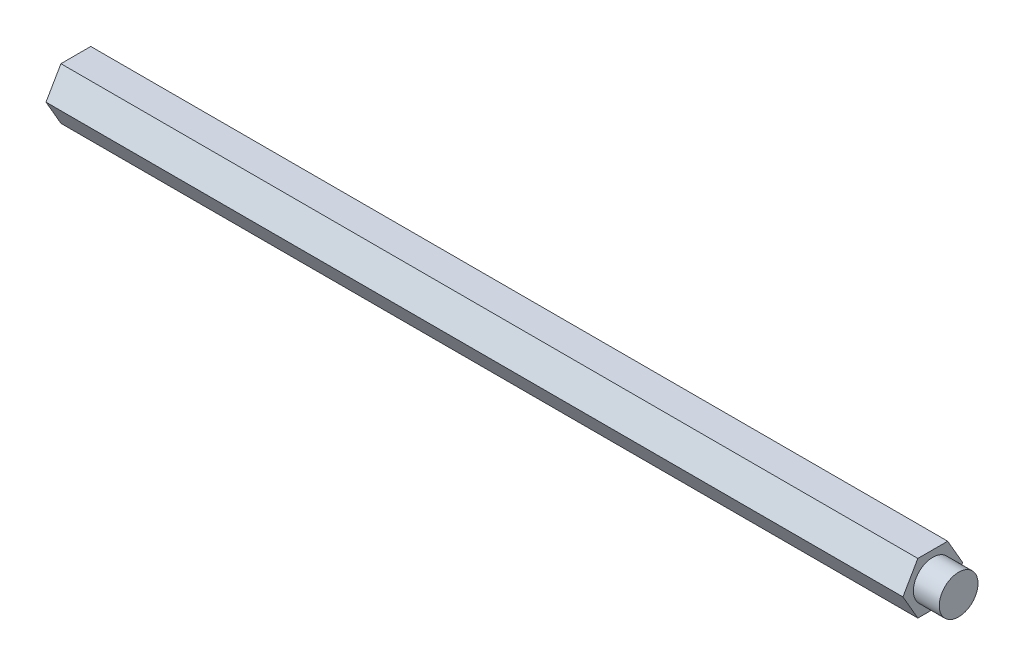
ISO-10303-21;
HEADER;
FILE_DESCRIPTION(('STEP AP214'),'2;1');
FILE_NAME('part.step','',(''),(''),'','','');
FILE_SCHEMA(('AUTOMOTIVE_DESIGN { 1 0 10303 214 1 1 1 1 }'));
ENDSEC;
DATA;
#1=APPLICATION_CONTEXT('core data for automotive mechanical design processes');
#2=APPLICATION_PROTOCOL_DEFINITION('international standard','automotive_design',2000,#1);
#3=PRODUCT_CONTEXT('',#1,'mechanical');
#4=PRODUCT('Part','Part','',(#3));
#5=PRODUCT_RELATED_PRODUCT_CATEGORY('part','',(#4));
#6=PRODUCT_DEFINITION_FORMATION('','',#4);
#7=PRODUCT_DEFINITION_CONTEXT('part definition',#1,'design');
#8=PRODUCT_DEFINITION('design','',#6,#7);
#9=PRODUCT_DEFINITION_SHAPE('','',#8);
#10=(LENGTH_UNIT() NAMED_UNIT(*) SI_UNIT(.MILLI.,.METRE.));
#11=(NAMED_UNIT(*) PLANE_ANGLE_UNIT() SI_UNIT($,.RADIAN.));
#12=(NAMED_UNIT(*) SI_UNIT($,.STERADIAN.) SOLID_ANGLE_UNIT());
#13=UNCERTAINTY_MEASURE_WITH_UNIT(LENGTH_MEASURE(1.E-05),#10,'distance_accuracy_value','');
#14=(GEOMETRIC_REPRESENTATION_CONTEXT(3) GLOBAL_UNCERTAINTY_ASSIGNED_CONTEXT((#13)) GLOBAL_UNIT_ASSIGNED_CONTEXT((#10,
#11,#12)) REPRESENTATION_CONTEXT('',''));
#15=CARTESIAN_POINT('',(0.,0.,0.));
#16=DIRECTION('',(0.,0.,1.));
#17=DIRECTION('',(1.,0.,0.));
#18=AXIS2_PLACEMENT_3D('',#15,#16,#17);
#19=CARTESIAN_POINT('',(210.53,-6.34999999999996,-3.6661742093542));
#20=DIRECTION('',(0.,0.499999999999995,0.866025403784441));
#21=DIRECTION('',(0.,-0.866025403784441,0.499999999999995));
#22=AXIS2_PLACEMENT_3D('',#19,#20,#21);
#23=PLANE('',#22);
#24=DIRECTION('',(0.,0.866025403784441,-0.499999999999995));
#25=VECTOR('',#24,1.);
#26=CARTESIAN_POINT('',(0.,-6.34999999999996,-3.6661742093542));
#27=LINE('',#26,#25);
#28=CARTESIAN_POINT('',(0.,-6.34999999999996,-3.6661742093542));
#29=VERTEX_POINT('',#28);
#30=CARTESIAN_POINT('',(0.,0.,-7.33234841870825));
#31=VERTEX_POINT('',#30);
#32=EDGE_CURVE('E127',#29,#31,#27,.T.);
#33=ORIENTED_EDGE('',*,*,#32,.T.);
#34=DIRECTION('',(-1.,0.,0.));
#35=VECTOR('',#34,1.);
#36=CARTESIAN_POINT('',(210.53,0.,-7.33234841870825));
#37=LINE('',#36,#35);
#38=CARTESIAN_POINT('',(210.53,0.,-7.33234841870825));
#39=VERTEX_POINT('',#38);
#40=EDGE_CURVE('E44',#39,#31,#37,.T.);
#41=ORIENTED_EDGE('',*,*,#40,.F.);
#42=DIRECTION('',(0.,0.866025403784441,-0.499999999999995));
#43=VECTOR('',#42,1.);
#44=CARTESIAN_POINT('',(210.53,-6.34999999999996,-3.6661742093542));
#45=LINE('',#44,#43);
#46=CARTESIAN_POINT('',(210.53,-6.34999999999996,-3.6661742093542));
#47=VERTEX_POINT('',#46);
#48=EDGE_CURVE('E138',#47,#39,#45,.T.);
#49=ORIENTED_EDGE('',*,*,#48,.F.);
#50=DIRECTION('',(-1.,0.,0.));
#51=VECTOR('',#50,1.);
#52=CARTESIAN_POINT('',(210.53,-6.34999999999996,-3.6661742093542));
#53=LINE('',#52,#51);
#54=EDGE_CURVE('E123',#47,#29,#53,.T.);
#55=ORIENTED_EDGE('',*,*,#54,.T.);
#56=EDGE_LOOP('',(#33,#41,#49,#55));
#57=FACE_BOUND('',#56,.T.);
#58=ADVANCED_FACE('F41',(#57),#23,.F.);
#59=CARTESIAN_POINT('',(210.53,0.,-7.33234841870825));
#60=DIRECTION('',(0.,-0.500000000000001,0.866025403784438));
#61=DIRECTION('',(0.,-0.866025403784438,-0.500000000000001));
#62=AXIS2_PLACEMENT_3D('',#59,#60,#61);
#63=PLANE('',#62);
#64=DIRECTION('',(0.,0.866025403784438,0.500000000000001));
#65=VECTOR('',#64,1.);
#66=CARTESIAN_POINT('',(0.,0.,-7.33234841870825));
#67=LINE('',#66,#65);
#68=CARTESIAN_POINT('',(0.,6.35000000000001,-3.66617420935411));
#69=VERTEX_POINT('',#68);
#70=EDGE_CURVE('E130',#31,#69,#67,.T.);
#71=ORIENTED_EDGE('',*,*,#70,.T.);
#72=DIRECTION('',(-1.,0.,0.));
#73=VECTOR('',#72,1.);
#74=CARTESIAN_POINT('',(210.53,6.35000000000001,-3.66617420935411));
#75=LINE('',#74,#73);
#76=CARTESIAN_POINT('',(210.53,6.35000000000001,-3.66617420935411));
#77=VERTEX_POINT('',#76);
#78=EDGE_CURVE('E141',#77,#69,#75,.T.);
#79=ORIENTED_EDGE('',*,*,#78,.F.);
#80=DIRECTION('',(0.,0.866025403784438,0.500000000000001));
#81=VECTOR('',#80,1.);
#82=CARTESIAN_POINT('',(210.53,0.,-7.33234841870825));
#83=LINE('',#82,#81);
#84=EDGE_CURVE('E96',#39,#77,#83,.T.);
#85=ORIENTED_EDGE('',*,*,#84,.F.);
#86=ORIENTED_EDGE('',*,*,#40,.T.);
#87=EDGE_LOOP('',(#71,#79,#85,#86));
#88=FACE_BOUND('',#87,.T.);
#89=ADVANCED_FACE('F146',(#88),#63,.F.);
#90=CARTESIAN_POINT('',(210.53,6.35000000000001,-3.66617420935411));
#91=DIRECTION('',(0.,-1.,0.));
#92=DIRECTION('',(0.,0.,-1.));
#93=AXIS2_PLACEMENT_3D('',#90,#91,#92);
#94=PLANE('',#93);
#95=DIRECTION('',(0.,0.,1.));
#96=VECTOR('',#95,1.);
#97=CARTESIAN_POINT('',(0.,6.35000000000001,-3.66617420935411));
#98=LINE('',#97,#96);
#99=CARTESIAN_POINT('',(0.,6.34999999999999,3.66617420935415));
#100=VERTEX_POINT('',#99);
#101=EDGE_CURVE('E133',#69,#100,#98,.T.);
#102=ORIENTED_EDGE('',*,*,#101,.T.);
#103=DIRECTION('',(-1.,0.,0.));
#104=VECTOR('',#103,1.);
#105=CARTESIAN_POINT('',(210.53,6.34999999999999,3.66617420935415));
#106=LINE('',#105,#104);
#107=CARTESIAN_POINT('',(210.53,6.34999999999999,3.66617420935415));
#108=VERTEX_POINT('',#107);
#109=EDGE_CURVE('E118',#108,#100,#106,.T.);
#110=ORIENTED_EDGE('',*,*,#109,.F.);
#111=DIRECTION('',(0.,0.,1.));
#112=VECTOR('',#111,1.);
#113=CARTESIAN_POINT('',(210.53,6.35000000000001,-3.66617420935411));
#114=LINE('',#113,#112);
#115=EDGE_CURVE('E109',#77,#108,#114,.T.);
#116=ORIENTED_EDGE('',*,*,#115,.F.);
#117=ORIENTED_EDGE('',*,*,#78,.T.);
#118=EDGE_LOOP('',(#102,#110,#116,#117));
#119=FACE_BOUND('',#118,.T.);
#120=ADVANCED_FACE('F152',(#119),#94,.F.);
#121=CARTESIAN_POINT('',(210.53,6.34999999999999,3.66617420935415));
#122=DIRECTION('',(0.,-0.499999999999995,-0.866025403784442));
#123=DIRECTION('',(0.,0.866025403784442,-0.499999999999995));
#124=AXIS2_PLACEMENT_3D('',#121,#122,#123);
#125=PLANE('',#124);
#126=DIRECTION('',(0.,-0.866025403784442,0.499999999999995));
#127=VECTOR('',#126,1.);
#128=CARTESIAN_POINT('',(0.,6.34999999999999,3.66617420935415));
#129=LINE('',#128,#127);
#130=CARTESIAN_POINT('',(0.,0.,7.33234841870825));
#131=VERTEX_POINT('',#130);
#132=EDGE_CURVE('E117',#100,#131,#129,.T.);
#133=ORIENTED_EDGE('',*,*,#132,.T.);
#134=DIRECTION('',(-1.,0.,0.));
#135=VECTOR('',#134,1.);
#136=CARTESIAN_POINT('',(210.53,0.,7.33234841870825));
#137=LINE('',#136,#135);
#138=CARTESIAN_POINT('',(210.53,0.,7.33234841870825));
#139=VERTEX_POINT('',#138);
#140=EDGE_CURVE('E114',#139,#131,#137,.T.);
#141=ORIENTED_EDGE('',*,*,#140,.F.);
#142=DIRECTION('',(0.,-0.866025403784442,0.499999999999995));
#143=VECTOR('',#142,1.);
#144=CARTESIAN_POINT('',(210.53,6.34999999999999,3.66617420935415));
#145=LINE('',#144,#143);
#146=EDGE_CURVE('E103',#108,#139,#145,.T.);
#147=ORIENTED_EDGE('',*,*,#146,.F.);
#148=ORIENTED_EDGE('',*,*,#109,.T.);
#149=EDGE_LOOP('',(#133,#141,#147,#148));
#150=FACE_BOUND('',#149,.T.);
#151=ADVANCED_FACE('F115',(#150),#125,.F.);
#152=CARTESIAN_POINT('',(210.53,0.,7.33234841870825));
#153=DIRECTION('',(0.,0.500000000000007,-0.866025403784434));
#154=DIRECTION('',(0.,0.866025403784435,0.500000000000007));
#155=AXIS2_PLACEMENT_3D('',#152,#153,#154);
#156=PLANE('',#155);
#157=DIRECTION('',(0.,-0.866025403784434,-0.500000000000007));
#158=VECTOR('',#157,1.);
#159=CARTESIAN_POINT('',(0.,0.,7.33234841870825));
#160=LINE('',#159,#158);
#161=CARTESIAN_POINT('',(0.,-6.35000000000004,3.66617420935407));
#162=VERTEX_POINT('',#161);
#163=EDGE_CURVE('E81',#131,#162,#160,.T.);
#164=ORIENTED_EDGE('',*,*,#163,.T.);
#165=DIRECTION('',(-1.,0.,0.));
#166=VECTOR('',#165,1.);
#167=CARTESIAN_POINT('',(210.53,-6.35000000000004,3.66617420935407));
#168=LINE('',#167,#166);
#169=CARTESIAN_POINT('',(210.53,-6.35000000000004,3.66617420935407));
#170=VERTEX_POINT('',#169);
#171=EDGE_CURVE('E119',#170,#162,#168,.T.);
#172=ORIENTED_EDGE('',*,*,#171,.F.);
#173=DIRECTION('',(0.,-0.866025403784434,-0.500000000000007));
#174=VECTOR('',#173,1.);
#175=CARTESIAN_POINT('',(210.53,0.,7.33234841870825));
#176=LINE('',#175,#174);
#177=EDGE_CURVE('E107',#139,#170,#176,.T.);
#178=ORIENTED_EDGE('',*,*,#177,.F.);
#179=ORIENTED_EDGE('',*,*,#140,.T.);
#180=EDGE_LOOP('',(#164,#172,#178,#179));
#181=FACE_BOUND('',#180,.T.);
#182=ADVANCED_FACE('F121',(#181),#156,.F.);
#183=CARTESIAN_POINT('',(210.53,-6.35000000000004,3.66617420935407));
#184=DIRECTION('',(0.,1.,0.));
#185=DIRECTION('',(0.,0.,1.));
#186=AXIS2_PLACEMENT_3D('',#183,#184,#185);
#187=PLANE('',#186);
#188=DIRECTION('',(0.,0.,-1.));
#189=VECTOR('',#188,1.);
#190=CARTESIAN_POINT('',(0.,-6.35000000000004,3.66617420935407));
#191=LINE('',#190,#189);
#192=EDGE_CURVE('E87',#162,#29,#191,.T.);
#193=ORIENTED_EDGE('',*,*,#192,.T.);
#194=ORIENTED_EDGE('',*,*,#54,.F.);
#195=DIRECTION('',(0.,0.,-1.));
#196=VECTOR('',#195,1.);
#197=CARTESIAN_POINT('',(210.53,-6.35000000000004,3.66617420935407));
#198=LINE('',#197,#196);
#199=EDGE_CURVE('E58',#170,#47,#198,.T.);
#200=ORIENTED_EDGE('',*,*,#199,.F.);
#201=ORIENTED_EDGE('',*,*,#171,.T.);
#202=EDGE_LOOP('',(#193,#194,#200,#201));
#203=FACE_BOUND('',#202,.T.);
#204=ADVANCED_FACE('F168',(#203),#187,.F.);
#205=CARTESIAN_POINT('',(210.53,0.,0.));
#206=DIRECTION('',(1.,0.,0.));
#207=DIRECTION('',(0.,0.,-1.));
#208=AXIS2_PLACEMENT_3D('',#205,#206,#207);
#209=PLANE('',#208);
#210=CARTESIAN_POINT('',(210.53,0.,0.));
#211=DIRECTION('',(1.,0.,0.));
#212=DIRECTION('',(0.,0.,-1.));
#213=AXIS2_PLACEMENT_3D('',#210,#211,#212);
#214=CIRCLE('',#213,4.7625);
#215=CARTESIAN_POINT('',(210.53,0.,-4.7625));
#216=VERTEX_POINT('',#215);
#217=EDGE_CURVE('E11',#216,#216,#214,.T.);
#218=ORIENTED_EDGE('',*,*,#217,.F.);
#219=EDGE_LOOP('',(#218));
#220=FACE_BOUND('',#219,.T.);
#221=ORIENTED_EDGE('',*,*,#48,.T.);
#222=ORIENTED_EDGE('',*,*,#84,.T.);
#223=ORIENTED_EDGE('',*,*,#115,.T.);
#224=ORIENTED_EDGE('',*,*,#146,.T.);
#225=ORIENTED_EDGE('',*,*,#177,.T.);
#226=ORIENTED_EDGE('',*,*,#199,.T.);
#227=EDGE_LOOP('',(#221,#222,#223,#224,#225,#226));
#228=FACE_BOUND('',#227,.T.);
#229=ADVANCED_FACE('F105',(#220,#228),#209,.T.);
#230=CARTESIAN_POINT('',(0.,0.,0.));
#231=DIRECTION('',(1.,0.,0.));
#232=DIRECTION('',(0.,0.,-1.));
#233=AXIS2_PLACEMENT_3D('',#230,#231,#232);
#234=PLANE('',#233);
#235=ORIENTED_EDGE('',*,*,#32,.F.);
#236=ORIENTED_EDGE('',*,*,#192,.F.);
#237=ORIENTED_EDGE('',*,*,#163,.F.);
#238=ORIENTED_EDGE('',*,*,#132,.F.);
#239=ORIENTED_EDGE('',*,*,#101,.F.);
#240=ORIENTED_EDGE('',*,*,#70,.F.);
#241=EDGE_LOOP('',(#235,#236,#237,#238,#239,#240));
#242=FACE_BOUND('',#241,.T.);
#243=ADVANCED_FACE('F151',(#242),#234,.F.);
#244=CARTESIAN_POINT('',(216.88,0.,0.));
#245=DIRECTION('',(-1.,0.,0.));
#246=DIRECTION('',(0.,0.,1.));
#247=AXIS2_PLACEMENT_3D('',#244,#245,#246);
#248=CYLINDRICAL_SURFACE('',#247,4.7625);
#249=CARTESIAN_POINT('',(216.88,0.,0.));
#250=DIRECTION('',(1.,0.,0.));
#251=DIRECTION('',(0.,0.,-1.));
#252=AXIS2_PLACEMENT_3D('',#249,#250,#251);
#253=CIRCLE('',#252,4.7625);
#254=CARTESIAN_POINT('',(216.88,0.,-4.7625));
#255=VERTEX_POINT('',#254);
#256=EDGE_CURVE('E131',#255,#255,#253,.T.);
#257=ORIENTED_EDGE('',*,*,#256,.F.);
#258=EDGE_LOOP('',(#257));
#259=FACE_BOUND('',#258,.T.);
#260=ORIENTED_EDGE('',*,*,#217,.T.);
#261=EDGE_LOOP('',(#260));
#262=FACE_BOUND('',#261,.T.);
#263=ADVANCED_FACE('F161',(#259,#262),#248,.T.);
#264=CARTESIAN_POINT('',(216.88,0.,0.));
#265=DIRECTION('',(1.,0.,0.));
#266=DIRECTION('',(0.,0.,-1.));
#267=AXIS2_PLACEMENT_3D('',#264,#265,#266);
#268=PLANE('',#267);
#269=ORIENTED_EDGE('',*,*,#256,.T.);
#270=EDGE_LOOP('',(#269));
#271=FACE_BOUND('',#270,.T.);
#272=ADVANCED_FACE('F159',(#271),#268,.T.);
#273=CLOSED_SHELL('',(#58,#89,#120,#151,#182,#204,#229,#243,#263,#272));
#274=MANIFOLD_SOLID_BREP('B2',#273);
#275=ADVANCED_BREP_SHAPE_REPRESENTATION('',(#18,#274),#14);
#276=SHAPE_DEFINITION_REPRESENTATION(#9,#275);
ENDSEC;
END-ISO-10303-21;
